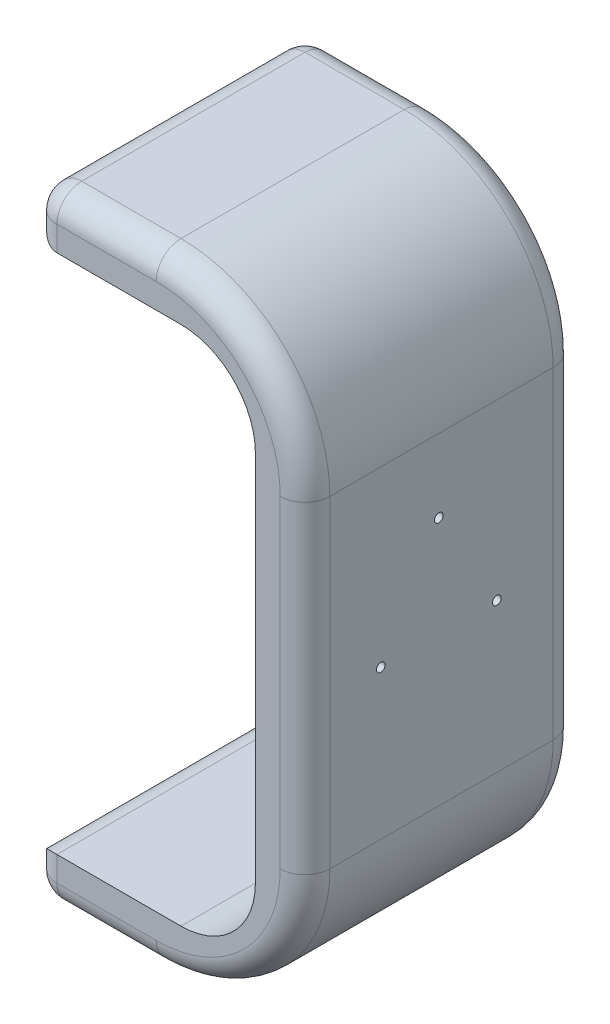
ISO-10303-21;
HEADER;
FILE_DESCRIPTION(('STEP AP214'),'2;1');
FILE_NAME('part.step','',(''),(''),'','','');
FILE_SCHEMA(('AUTOMOTIVE_DESIGN { 1 0 10303 214 1 1 1 1 }'));
ENDSEC;
DATA;
#1=APPLICATION_CONTEXT('core data for automotive mechanical design processes');
#2=APPLICATION_PROTOCOL_DEFINITION('international standard','automotive_design',2000,#1);
#3=PRODUCT_CONTEXT('',#1,'mechanical');
#4=PRODUCT('Part','Part','',(#3));
#5=PRODUCT_RELATED_PRODUCT_CATEGORY('part','',(#4));
#6=PRODUCT_DEFINITION_FORMATION('','',#4);
#7=PRODUCT_DEFINITION_CONTEXT('part definition',#1,'design');
#8=PRODUCT_DEFINITION('design','',#6,#7);
#9=PRODUCT_DEFINITION_SHAPE('','',#8);
#10=(LENGTH_UNIT() NAMED_UNIT(*) SI_UNIT(.MILLI.,.METRE.));
#11=(NAMED_UNIT(*) PLANE_ANGLE_UNIT() SI_UNIT($,.RADIAN.));
#12=(NAMED_UNIT(*) SI_UNIT($,.STERADIAN.) SOLID_ANGLE_UNIT());
#13=UNCERTAINTY_MEASURE_WITH_UNIT(LENGTH_MEASURE(1.E-05),#10,'distance_accuracy_value','');
#14=(GEOMETRIC_REPRESENTATION_CONTEXT(3) GLOBAL_UNCERTAINTY_ASSIGNED_CONTEXT((#13)) GLOBAL_UNIT_ASSIGNED_CONTEXT((#10,
#11,#12)) REPRESENTATION_CONTEXT('',''));
#15=CARTESIAN_POINT('',(0.,0.,0.));
#16=DIRECTION('',(0.,0.,1.));
#17=DIRECTION('',(1.,0.,0.));
#18=AXIS2_PLACEMENT_3D('',#15,#16,#17);
#19=CARTESIAN_POINT('',(90.,-20.,110.));
#20=DIRECTION('',(0.,1.,0.));
#21=DIRECTION('',(-1.,0.,0.));
#22=AXIS2_PLACEMENT_3D('',#19,#20,#21);
#23=PLANE('',#22);
#24=DIRECTION('',(1.,0.,0.));
#25=VECTOR('',#24,1.);
#26=CARTESIAN_POINT('',(90.,-20.,110.));
#27=LINE('',#26,#25);
#28=CARTESIAN_POINT('',(10.,-20.,110.));
#29=VERTEX_POINT('',#28);
#30=CARTESIAN_POINT('',(60.,-20.,110.));
#31=VERTEX_POINT('',#30);
#32=EDGE_CURVE('E734',#29,#31,#27,.T.);
#33=ORIENTED_EDGE('',*,*,#32,.F.);
#34=DIRECTION('',(0.,0.,-1.));
#35=VECTOR('',#34,1.);
#36=CARTESIAN_POINT('',(9.99999999999999,-20.,110.));
#37=LINE('',#36,#35);
#38=CARTESIAN_POINT('',(10.,-20.,0.));
#39=VERTEX_POINT('',#38);
#40=EDGE_CURVE('E312',#29,#39,#37,.T.);
#41=ORIENTED_EDGE('',*,*,#40,.T.);
#42=DIRECTION('',(1.,0.,0.));
#43=VECTOR('',#42,1.);
#44=CARTESIAN_POINT('',(90.,-20.,0.));
#45=LINE('',#44,#43);
#46=CARTESIAN_POINT('',(60.,-20.,0.));
#47=VERTEX_POINT('',#46);
#48=EDGE_CURVE('E219',#39,#47,#45,.T.);
#49=ORIENTED_EDGE('',*,*,#48,.T.);
#50=DIRECTION('',(0.,0.,-1.));
#51=VECTOR('',#50,1.);
#52=CARTESIAN_POINT('',(60.,-20.,110.));
#53=LINE('',#52,#51);
#54=EDGE_CURVE('E760',#47,#31,#53,.F.);
#55=ORIENTED_EDGE('',*,*,#54,.T.);
#56=EDGE_LOOP('',(#33,#41,#49,#55));
#57=FACE_BOUND('',#56,.T.);
#58=ADVANCED_FACE('F35',(#57),#23,.F.);
#59=CARTESIAN_POINT('',(90.,-230.,110.));
#60=DIRECTION('',(1.,0.,0.));
#61=DIRECTION('',(0.,0.,-1.));
#62=AXIS2_PLACEMENT_3D('',#59,#60,#61);
#63=PLANE('',#62);
#64=CARTESIAN_POINT('',(90.,-89.4408599082747,56.0696259528289));
#65=DIRECTION('',(-1.,0.,0.));
#66=DIRECTION('',(0.,0.,1.));
#67=AXIS2_PLACEMENT_3D('',#64,#65,#66);
#68=CIRCLE('',#67,1.75);
#69=CARTESIAN_POINT('',(90.,-89.4408599082747,57.8196259528289));
#70=VERTEX_POINT('',#69);
#71=EDGE_CURVE('E223',#70,#70,#68,.T.);
#72=ORIENTED_EDGE('',*,*,#71,.F.);
#73=EDGE_LOOP('',(#72));
#74=FACE_BOUND('',#73,.T.);
#75=CARTESIAN_POINT('',(90.,-129.940859908274,79.4523118550099));
#76=DIRECTION('',(-1.,0.,0.));
#77=DIRECTION('',(0.,0.,1.));
#78=AXIS2_PLACEMENT_3D('',#75,#76,#77);
#79=CIRCLE('',#78,1.75000000000002);
#80=CARTESIAN_POINT('',(90.,-129.940859908274,81.2023118550099));
#81=VERTEX_POINT('',#80);
#82=EDGE_CURVE('E781',#81,#81,#79,.T.);
#83=ORIENTED_EDGE('',*,*,#82,.F.);
#84=EDGE_LOOP('',(#83));
#85=FACE_BOUND('',#84,.T.);
#86=CARTESIAN_POINT('',(90.,-129.940859908275,32.6869400506501));
#87=DIRECTION('',(-1.,0.,0.));
#88=DIRECTION('',(0.,0.,1.));
#89=AXIS2_PLACEMENT_3D('',#86,#87,#88);
#90=CIRCLE('',#89,1.75);
#91=CARTESIAN_POINT('',(90.,-129.940859908275,34.4369400506501));
#92=VERTEX_POINT('',#91);
#93=EDGE_CURVE('E778',#92,#92,#90,.T.);
#94=ORIENTED_EDGE('',*,*,#93,.F.);
#95=EDGE_LOOP('',(#94));
#96=FACE_BOUND('',#95,.T.);
#97=DIRECTION('',(0.,-1.,0.));
#98=VECTOR('',#97,1.);
#99=CARTESIAN_POINT('',(90.,-230.,110.));
#100=LINE('',#99,#98);
#101=CARTESIAN_POINT('',(90.,-50.,110.));
#102=VERTEX_POINT('',#101);
#103=CARTESIAN_POINT('',(90.,-200.,110.));
#104=VERTEX_POINT('',#103);
#105=EDGE_CURVE('E774',#102,#104,#100,.T.);
#106=ORIENTED_EDGE('',*,*,#105,.F.);
#107=DIRECTION('',(0.,0.,-1.));
#108=VECTOR('',#107,1.);
#109=CARTESIAN_POINT('',(90.,-50.,0.));
#110=LINE('',#109,#108);
#111=CARTESIAN_POINT('',(90.,-50.,0.));
#112=VERTEX_POINT('',#111);
#113=EDGE_CURVE('E763',#102,#112,#110,.T.);
#114=ORIENTED_EDGE('',*,*,#113,.T.);
#115=DIRECTION('',(0.,-1.,0.));
#116=VECTOR('',#115,1.);
#117=CARTESIAN_POINT('',(90.,-230.,0.));
#118=LINE('',#117,#116);
#119=CARTESIAN_POINT('',(90.,-200.,0.));
#120=VERTEX_POINT('',#119);
#121=EDGE_CURVE('E735',#112,#120,#118,.T.);
#122=ORIENTED_EDGE('',*,*,#121,.T.);
#123=DIRECTION('',(0.,0.,-1.));
#124=VECTOR('',#123,1.);
#125=CARTESIAN_POINT('',(90.,-200.,110.));
#126=LINE('',#125,#124);
#127=EDGE_CURVE('E765',#120,#104,#126,.F.);
#128=ORIENTED_EDGE('',*,*,#127,.T.);
#129=EDGE_LOOP('',(#106,#114,#122,#128));
#130=FACE_BOUND('',#129,.T.);
#131=ADVANCED_FACE('F406',(#74,#85,#96,#130),#63,.F.);
#132=CARTESIAN_POINT('',(0.,-230.,110.));
#133=DIRECTION('',(0.,-1.,0.));
#134=DIRECTION('',(0.,0.,-1.));
#135=AXIS2_PLACEMENT_3D('',#132,#133,#134);
#136=PLANE('',#135);
#137=DIRECTION('',(-1.,0.,0.));
#138=VECTOR('',#137,1.);
#139=CARTESIAN_POINT('',(0.,-230.,0.));
#140=LINE('',#139,#138);
#141=CARTESIAN_POINT('',(60.,-230.,0.));
#142=VERTEX_POINT('',#141);
#143=CARTESIAN_POINT('',(10.,-230.,0.));
#144=VERTEX_POINT('',#143);
#145=EDGE_CURVE('E729',#142,#144,#140,.T.);
#146=ORIENTED_EDGE('',*,*,#145,.T.);
#147=DIRECTION('',(0.,0.,-1.));
#148=VECTOR('',#147,1.);
#149=CARTESIAN_POINT('',(10.,-230.,110.));
#150=LINE('',#149,#148);
#151=CARTESIAN_POINT('',(10.,-230.,110.));
#152=VERTEX_POINT('',#151);
#153=EDGE_CURVE('E314',#144,#152,#150,.F.);
#154=ORIENTED_EDGE('',*,*,#153,.T.);
#155=DIRECTION('',(-1.,0.,0.));
#156=VECTOR('',#155,1.);
#157=CARTESIAN_POINT('',(0.,-230.,110.));
#158=LINE('',#157,#156);
#159=CARTESIAN_POINT('',(60.,-230.,110.));
#160=VERTEX_POINT('',#159);
#161=EDGE_CURVE('E361',#160,#152,#158,.T.);
#162=ORIENTED_EDGE('',*,*,#161,.F.);
#163=DIRECTION('',(0.,0.,-1.));
#164=VECTOR('',#163,1.);
#165=CARTESIAN_POINT('',(60.,-230.,0.));
#166=LINE('',#165,#164);
#167=EDGE_CURVE('E733',#160,#142,#166,.T.);
#168=ORIENTED_EDGE('',*,*,#167,.T.);
#169=EDGE_LOOP('',(#146,#154,#162,#168));
#170=FACE_BOUND('',#169,.T.);
#171=ADVANCED_FACE('F412',(#170),#136,.F.);
#172=CARTESIAN_POINT('',(110.,-250.,110.));
#173=DIRECTION('',(0.,1.,0.));
#174=DIRECTION('',(0.,0.,1.));
#175=AXIS2_PLACEMENT_3D('',#172,#173,#174);
#176=PLANE('',#175);
#177=DIRECTION('',(0.,0.,-1.));
#178=VECTOR('',#177,1.);
#179=CARTESIAN_POINT('',(9.99999999999999,-250.,110.));
#180=LINE('',#179,#178);
#181=CARTESIAN_POINT('',(9.99999999999999,-250.,100.));
#182=VERTEX_POINT('',#181);
#183=CARTESIAN_POINT('',(9.99999999999999,-250.,9.99999999999999));
#184=VERTEX_POINT('',#183);
#185=EDGE_CURVE('E743',#182,#184,#180,.T.);
#186=ORIENTED_EDGE('',*,*,#185,.T.);
#187=DIRECTION('',(1.,0.,0.));
#188=VECTOR('',#187,1.);
#189=CARTESIAN_POINT('',(50.,-250.,9.99999999999999));
#190=LINE('',#189,#188);
#191=CARTESIAN_POINT('',(50.,-250.,9.99999999999999));
#192=VERTEX_POINT('',#191);
#193=EDGE_CURVE('E378',#184,#192,#190,.T.);
#194=ORIENTED_EDGE('',*,*,#193,.T.);
#195=DIRECTION('',(0.,0.,-1.));
#196=VECTOR('',#195,1.);
#197=CARTESIAN_POINT('',(50.,-250.,110.));
#198=LINE('',#197,#196);
#199=CARTESIAN_POINT('',(50.,-250.,100.));
#200=VERTEX_POINT('',#199);
#201=EDGE_CURVE('E767',#192,#200,#198,.F.);
#202=ORIENTED_EDGE('',*,*,#201,.T.);
#203=DIRECTION('',(1.,0.,0.));
#204=VECTOR('',#203,1.);
#205=CARTESIAN_POINT('',(110.,-250.,100.));
#206=LINE('',#205,#204);
#207=EDGE_CURVE('E747',#200,#182,#206,.F.);
#208=ORIENTED_EDGE('',*,*,#207,.T.);
#209=EDGE_LOOP('',(#186,#194,#202,#208));
#210=FACE_BOUND('',#209,.T.);
#211=ADVANCED_FACE('F685',(#210),#176,.F.);
#212=CARTESIAN_POINT('',(110.,0.,110.));
#213=DIRECTION('',(-1.,0.,0.));
#214=DIRECTION('',(0.,-1.,0.));
#215=AXIS2_PLACEMENT_3D('',#212,#213,#214);
#216=PLANE('',#215);
#217=CARTESIAN_POINT('',(110.,-89.4408599082747,56.0696259528289));
#218=DIRECTION('',(-1.,0.,0.));
#219=DIRECTION('',(0.,-1.,0.));
#220=AXIS2_PLACEMENT_3D('',#217,#218,#219);
#221=CIRCLE('',#220,1.75);
#222=CARTESIAN_POINT('',(110.,-91.1908599082747,56.0696259528289));
#223=VERTEX_POINT('',#222);
#224=EDGE_CURVE('E39',#223,#223,#221,.T.);
#225=ORIENTED_EDGE('',*,*,#224,.T.);
#226=EDGE_LOOP('',(#225));
#227=FACE_BOUND('',#226,.T.);
#228=CARTESIAN_POINT('',(110.,-129.940859908274,79.4523118550099));
#229=DIRECTION('',(-1.,0.,0.));
#230=DIRECTION('',(0.,-1.,0.));
#231=AXIS2_PLACEMENT_3D('',#228,#229,#230);
#232=CIRCLE('',#231,1.75000000000002);
#233=CARTESIAN_POINT('',(110.,-131.690859908274,79.4523118550099));
#234=VERTEX_POINT('',#233);
#235=EDGE_CURVE('E222',#234,#234,#232,.T.);
#236=ORIENTED_EDGE('',*,*,#235,.T.);
#237=EDGE_LOOP('',(#236));
#238=FACE_BOUND('',#237,.T.);
#239=CARTESIAN_POINT('',(110.,-129.940859908275,32.6869400506501));
#240=DIRECTION('',(-1.,0.,0.));
#241=DIRECTION('',(0.,-1.,0.));
#242=AXIS2_PLACEMENT_3D('',#239,#240,#241);
#243=CIRCLE('',#242,1.75);
#244=CARTESIAN_POINT('',(110.,-131.690859908275,32.6869400506501));
#245=VERTEX_POINT('',#244);
#246=EDGE_CURVE('E220',#245,#245,#243,.T.);
#247=ORIENTED_EDGE('',*,*,#246,.T.);
#248=EDGE_LOOP('',(#247));
#249=FACE_BOUND('',#248,.T.);
#250=DIRECTION('',(0.,0.,-1.));
#251=VECTOR('',#250,1.);
#252=CARTESIAN_POINT('',(110.,-190.,110.));
#253=LINE('',#252,#251);
#254=CARTESIAN_POINT('',(110.,-190.,100.));
#255=VERTEX_POINT('',#254);
#256=CARTESIAN_POINT('',(110.,-190.,9.99999999999999));
#257=VERTEX_POINT('',#256);
#258=EDGE_CURVE('E320',#255,#257,#253,.T.);
#259=ORIENTED_EDGE('',*,*,#258,.T.);
#260=DIRECTION('',(0.,1.,0.));
#261=VECTOR('',#260,1.);
#262=CARTESIAN_POINT('',(110.,-60.,9.99999999999999));
#263=LINE('',#262,#261);
#264=CARTESIAN_POINT('',(110.,-60.,9.99999999999999));
#265=VERTEX_POINT('',#264);
#266=EDGE_CURVE('E11',#257,#265,#263,.T.);
#267=ORIENTED_EDGE('',*,*,#266,.T.);
#268=DIRECTION('',(0.,0.,-1.));
#269=VECTOR('',#268,1.);
#270=CARTESIAN_POINT('',(110.,-60.,110.));
#271=LINE('',#270,#269);
#272=CARTESIAN_POINT('',(110.,-60.,100.));
#273=VERTEX_POINT('',#272);
#274=EDGE_CURVE('E323',#265,#273,#271,.F.);
#275=ORIENTED_EDGE('',*,*,#274,.T.);
#276=DIRECTION('',(0.,1.,0.));
#277=VECTOR('',#276,1.);
#278=CARTESIAN_POINT('',(110.,0.,100.));
#279=LINE('',#278,#277);
#280=EDGE_CURVE('E45',#273,#255,#279,.F.);
#281=ORIENTED_EDGE('',*,*,#280,.T.);
#282=EDGE_LOOP('',(#259,#267,#275,#281));
#283=FACE_BOUND('',#282,.T.);
#284=ADVANCED_FACE('F319',(#227,#238,#249,#283),#216,.F.);
#285=CARTESIAN_POINT('',(0.,0.,110.));
#286=DIRECTION('',(0.,-1.,0.));
#287=DIRECTION('',(0.,0.,-1.));
#288=AXIS2_PLACEMENT_3D('',#285,#286,#287);
#289=PLANE('',#288);
#290=DIRECTION('',(0.,0.,-1.));
#291=VECTOR('',#290,1.);
#292=CARTESIAN_POINT('',(50.,0.,110.));
#293=LINE('',#292,#291);
#294=CARTESIAN_POINT('',(50.,0.,100.));
#295=VERTEX_POINT('',#294);
#296=CARTESIAN_POINT('',(50.,0.,9.99999999999999));
#297=VERTEX_POINT('',#296);
#298=EDGE_CURVE('E331',#295,#297,#293,.T.);
#299=ORIENTED_EDGE('',*,*,#298,.T.);
#300=DIRECTION('',(-1.,0.,0.));
#301=VECTOR('',#300,1.);
#302=CARTESIAN_POINT('',(0.,0.,9.99999999999999));
#303=LINE('',#302,#301);
#304=CARTESIAN_POINT('',(10.,0.,9.99999999999999));
#305=VERTEX_POINT('',#304);
#306=EDGE_CURVE('E348',#297,#305,#303,.T.);
#307=ORIENTED_EDGE('',*,*,#306,.T.);
#308=DIRECTION('',(0.,0.,-1.));
#309=VECTOR('',#308,1.);
#310=CARTESIAN_POINT('',(10.,0.,110.));
#311=LINE('',#310,#309);
#312=CARTESIAN_POINT('',(10.,0.,100.));
#313=VERTEX_POINT('',#312);
#314=EDGE_CURVE('E340',#305,#313,#311,.F.);
#315=ORIENTED_EDGE('',*,*,#314,.T.);
#316=DIRECTION('',(-1.,0.,0.));
#317=VECTOR('',#316,1.);
#318=CARTESIAN_POINT('',(0.,0.,100.));
#319=LINE('',#318,#317);
#320=EDGE_CURVE('E205',#313,#295,#319,.F.);
#321=ORIENTED_EDGE('',*,*,#320,.T.);
#322=EDGE_LOOP('',(#299,#307,#315,#321));
#323=FACE_BOUND('',#322,.T.);
#324=ADVANCED_FACE('F359',(#323),#289,.F.);
#325=CARTESIAN_POINT('',(0.,0.,110.));
#326=DIRECTION('',(0.,0.,-1.));
#327=DIRECTION('',(-1.,0.,0.));
#328=AXIS2_PLACEMENT_3D('',#325,#326,#327);
#329=PLANE('',#328);
#330=ORIENTED_EDGE('',*,*,#161,.T.);
#331=DIRECTION('',(0.,-1.,0.));
#332=VECTOR('',#331,1.);
#333=CARTESIAN_POINT('',(10.,0.,110.));
#334=LINE('',#333,#332);
#335=CARTESIAN_POINT('',(10.,-240.,110.));
#336=VERTEX_POINT('',#335);
#337=EDGE_CURVE('E54',#152,#336,#334,.T.);
#338=ORIENTED_EDGE('',*,*,#337,.T.);
#339=DIRECTION('',(1.,0.,0.));
#340=VECTOR('',#339,1.);
#341=CARTESIAN_POINT('',(0.,-240.,110.));
#342=LINE('',#341,#340);
#343=CARTESIAN_POINT('',(50.,-240.,110.));
#344=VERTEX_POINT('',#343);
#345=EDGE_CURVE('E200',#336,#344,#342,.T.);
#346=ORIENTED_EDGE('',*,*,#345,.T.);
#347=CARTESIAN_POINT('',(50.,-190.,110.));
#348=DIRECTION('',(0.,0.,-1.));
#349=DIRECTION('',(-1.,0.,0.));
#350=AXIS2_PLACEMENT_3D('',#347,#348,#349);
#351=CIRCLE('',#350,50.);
#352=CARTESIAN_POINT('',(100.,-190.,110.));
#353=VERTEX_POINT('',#352);
#354=EDGE_CURVE('E195',#344,#353,#351,.F.);
#355=ORIENTED_EDGE('',*,*,#354,.T.);
#356=DIRECTION('',(0.,1.,0.));
#357=VECTOR('',#356,1.);
#358=CARTESIAN_POINT('',(100.,0.,110.));
#359=LINE('',#358,#357);
#360=CARTESIAN_POINT('',(100.,-60.,110.));
#361=VERTEX_POINT('',#360);
#362=EDGE_CURVE('E299',#353,#361,#359,.T.);
#363=ORIENTED_EDGE('',*,*,#362,.T.);
#364=CARTESIAN_POINT('',(50.,-60.,110.));
#365=DIRECTION('',(0.,0.,-1.));
#366=DIRECTION('',(-1.,0.,0.));
#367=AXIS2_PLACEMENT_3D('',#364,#365,#366);
#368=CIRCLE('',#367,50.);
#369=CARTESIAN_POINT('',(50.,-10.,110.));
#370=VERTEX_POINT('',#369);
#371=EDGE_CURVE('E190',#361,#370,#368,.F.);
#372=ORIENTED_EDGE('',*,*,#371,.T.);
#373=DIRECTION('',(-1.,0.,0.));
#374=VECTOR('',#373,1.);
#375=CARTESIAN_POINT('',(0.,-10.,110.));
#376=LINE('',#375,#374);
#377=CARTESIAN_POINT('',(10.,-10.,110.));
#378=VERTEX_POINT('',#377);
#379=EDGE_CURVE('E185',#370,#378,#376,.T.);
#380=ORIENTED_EDGE('',*,*,#379,.T.);
#381=DIRECTION('',(0.,-1.,0.));
#382=VECTOR('',#381,1.);
#383=CARTESIAN_POINT('',(10.,0.,110.));
#384=LINE('',#383,#382);
#385=EDGE_CURVE('E187',#378,#29,#384,.T.);
#386=ORIENTED_EDGE('',*,*,#385,.T.);
#387=ORIENTED_EDGE('',*,*,#32,.T.);
#388=CARTESIAN_POINT('',(60.,-50.,110.));
#389=DIRECTION('',(0.,0.,-1.));
#390=DIRECTION('',(-1.,0.,0.));
#391=AXIS2_PLACEMENT_3D('',#388,#389,#390);
#392=CIRCLE('',#391,30.);
#393=EDGE_CURVE('E756',#31,#102,#392,.T.);
#394=ORIENTED_EDGE('',*,*,#393,.T.);
#395=ORIENTED_EDGE('',*,*,#105,.T.);
#396=CARTESIAN_POINT('',(60.,-200.,110.));
#397=DIRECTION('',(0.,0.,-1.));
#398=DIRECTION('',(-1.,0.,0.));
#399=AXIS2_PLACEMENT_3D('',#396,#397,#398);
#400=CIRCLE('',#399,30.);
#401=EDGE_CURVE('E750',#104,#160,#400,.T.);
#402=ORIENTED_EDGE('',*,*,#401,.T.);
#403=EDGE_LOOP('',(#330,#338,#346,#355,#363,#372,#380,#386,#387,#394,#395,#402));
#404=FACE_BOUND('',#403,.T.);
#405=ADVANCED_FACE('F186',(#404),#329,.F.);
#406=CARTESIAN_POINT('',(0.,0.,0.));
#407=DIRECTION('',(0.,0.,-1.));
#408=DIRECTION('',(-1.,0.,0.));
#409=AXIS2_PLACEMENT_3D('',#406,#407,#408);
#410=PLANE('',#409);
#411=DIRECTION('',(1.,0.,0.));
#412=VECTOR('',#411,1.);
#413=CARTESIAN_POINT('',(0.,-240.,0.));
#414=LINE('',#413,#412);
#415=CARTESIAN_POINT('',(50.,-240.,0.));
#416=VERTEX_POINT('',#415);
#417=CARTESIAN_POINT('',(10.,-240.,0.));
#418=VERTEX_POINT('',#417);
#419=EDGE_CURVE('E383',#416,#418,#414,.F.);
#420=ORIENTED_EDGE('',*,*,#419,.T.);
#421=DIRECTION('',(0.,-1.,0.));
#422=VECTOR('',#421,1.);
#423=CARTESIAN_POINT('',(10.,-230.,0.));
#424=LINE('',#423,#422);
#425=EDGE_CURVE('E338',#418,#144,#424,.F.);
#426=ORIENTED_EDGE('',*,*,#425,.T.);
#427=ORIENTED_EDGE('',*,*,#145,.F.);
#428=CARTESIAN_POINT('',(60.,-200.,0.));
#429=DIRECTION('',(0.,0.,-1.));
#430=DIRECTION('',(-1.,0.,0.));
#431=AXIS2_PLACEMENT_3D('',#428,#429,#430);
#432=CIRCLE('',#431,30.);
#433=EDGE_CURVE('E754',#142,#120,#432,.F.);
#434=ORIENTED_EDGE('',*,*,#433,.T.);
#435=ORIENTED_EDGE('',*,*,#121,.F.);
#436=CARTESIAN_POINT('',(60.,-50.,0.));
#437=DIRECTION('',(0.,0.,-1.));
#438=DIRECTION('',(-1.,0.,0.));
#439=AXIS2_PLACEMENT_3D('',#436,#437,#438);
#440=CIRCLE('',#439,30.);
#441=EDGE_CURVE('E87',#112,#47,#440,.F.);
#442=ORIENTED_EDGE('',*,*,#441,.T.);
#443=ORIENTED_EDGE('',*,*,#48,.F.);
#444=DIRECTION('',(0.,-1.,0.));
#445=VECTOR('',#444,1.);
#446=CARTESIAN_POINT('',(10.,0.,0.));
#447=LINE('',#446,#445);
#448=CARTESIAN_POINT('',(10.,-10.,0.));
#449=VERTEX_POINT('',#448);
#450=EDGE_CURVE('E342',#39,#449,#447,.F.);
#451=ORIENTED_EDGE('',*,*,#450,.T.);
#452=DIRECTION('',(-1.,0.,0.));
#453=VECTOR('',#452,1.);
#454=CARTESIAN_POINT('',(50.,-10.,0.));
#455=LINE('',#454,#453);
#456=CARTESIAN_POINT('',(50.,-10.,0.));
#457=VERTEX_POINT('',#456);
#458=EDGE_CURVE('E373',#449,#457,#455,.F.);
#459=ORIENTED_EDGE('',*,*,#458,.T.);
#460=CARTESIAN_POINT('',(50.,-60.,0.));
#461=DIRECTION('',(0.,0.,-1.));
#462=DIRECTION('',(-1.,0.,0.));
#463=AXIS2_PLACEMENT_3D('',#460,#461,#462);
#464=CIRCLE('',#463,50.);
#465=CARTESIAN_POINT('',(100.,-60.,0.));
#466=VERTEX_POINT('',#465);
#467=EDGE_CURVE('E370',#457,#466,#464,.T.);
#468=ORIENTED_EDGE('',*,*,#467,.T.);
#469=DIRECTION('',(0.,1.,0.));
#470=VECTOR('',#469,1.);
#471=CARTESIAN_POINT('',(100.,-190.,0.));
#472=LINE('',#471,#470);
#473=CARTESIAN_POINT('',(100.,-190.,0.));
#474=VERTEX_POINT('',#473);
#475=EDGE_CURVE('E374',#466,#474,#472,.F.);
#476=ORIENTED_EDGE('',*,*,#475,.T.);
#477=CARTESIAN_POINT('',(50.,-190.,0.));
#478=DIRECTION('',(0.,0.,-1.));
#479=DIRECTION('',(-1.,0.,0.));
#480=AXIS2_PLACEMENT_3D('',#477,#478,#479);
#481=CIRCLE('',#480,50.);
#482=EDGE_CURVE('E376',#474,#416,#481,.T.);
#483=ORIENTED_EDGE('',*,*,#482,.T.);
#484=EDGE_LOOP('',(#420,#426,#427,#434,#435,#442,#443,#451,#459,#468,#476,#483));
#485=FACE_BOUND('',#484,.T.);
#486=ADVANCED_FACE('F388',(#485),#410,.T.);
#487=CARTESIAN_POINT('',(50.,-60.,110.));
#488=DIRECTION('',(0.,0.,-1.));
#489=DIRECTION('',(-1.,0.,0.));
#490=AXIS2_PLACEMENT_3D('',#487,#488,#489);
#491=CYLINDRICAL_SURFACE('',#490,60.);
#492=ORIENTED_EDGE('',*,*,#274,.F.);
#493=CARTESIAN_POINT('',(50.,-60.,9.99999999999999));
#494=DIRECTION('',(0.,0.,-1.));
#495=DIRECTION('',(-1.,0.,0.));
#496=AXIS2_PLACEMENT_3D('',#493,#494,#495);
#497=CIRCLE('',#496,60.);
#498=EDGE_CURVE('E305',#265,#297,#497,.F.);
#499=ORIENTED_EDGE('',*,*,#498,.T.);
#500=ORIENTED_EDGE('',*,*,#298,.F.);
#501=CARTESIAN_POINT('',(50.,-60.,100.));
#502=DIRECTION('',(0.,0.,-1.));
#503=DIRECTION('',(-1.,0.,0.));
#504=AXIS2_PLACEMENT_3D('',#501,#502,#503);
#505=CIRCLE('',#504,60.);
#506=EDGE_CURVE('E303',#295,#273,#505,.T.);
#507=ORIENTED_EDGE('',*,*,#506,.T.);
#508=EDGE_LOOP('',(#492,#499,#500,#507));
#509=FACE_BOUND('',#508,.T.);
#510=ADVANCED_FACE('F354',(#509),#491,.T.);
#511=CARTESIAN_POINT('',(50.,-190.,110.));
#512=DIRECTION('',(0.,0.,-1.));
#513=DIRECTION('',(-1.,0.,0.));
#514=AXIS2_PLACEMENT_3D('',#511,#512,#513);
#515=CYLINDRICAL_SURFACE('',#514,60.);
#516=ORIENTED_EDGE('',*,*,#201,.F.);
#517=CARTESIAN_POINT('',(50.,-190.,9.99999999999999));
#518=DIRECTION('',(0.,0.,-1.));
#519=DIRECTION('',(-1.,0.,0.));
#520=AXIS2_PLACEMENT_3D('',#517,#518,#519);
#521=CIRCLE('',#520,60.);
#522=EDGE_CURVE('E330',#192,#257,#521,.F.);
#523=ORIENTED_EDGE('',*,*,#522,.T.);
#524=ORIENTED_EDGE('',*,*,#258,.F.);
#525=CARTESIAN_POINT('',(50.,-190.,100.));
#526=DIRECTION('',(0.,0.,-1.));
#527=DIRECTION('',(-1.,0.,0.));
#528=AXIS2_PLACEMENT_3D('',#525,#526,#527);
#529=CIRCLE('',#528,60.);
#530=EDGE_CURVE('E328',#255,#200,#529,.T.);
#531=ORIENTED_EDGE('',*,*,#530,.T.);
#532=EDGE_LOOP('',(#516,#523,#524,#531));
#533=FACE_BOUND('',#532,.T.);
#534=ADVANCED_FACE('F326',(#533),#515,.T.);
#535=CARTESIAN_POINT('',(60.,-50.,110.));
#536=DIRECTION('',(0.,0.,1.));
#537=DIRECTION('',(1.,0.,0.));
#538=AXIS2_PLACEMENT_3D('',#535,#536,#537);
#539=CYLINDRICAL_SURFACE('',#538,30.);
#540=ORIENTED_EDGE('',*,*,#393,.F.);
#541=ORIENTED_EDGE('',*,*,#54,.F.);
#542=ORIENTED_EDGE('',*,*,#441,.F.);
#543=ORIENTED_EDGE('',*,*,#113,.F.);
#544=EDGE_LOOP('',(#540,#541,#542,#543));
#545=FACE_BOUND('',#544,.T.);
#546=ADVANCED_FACE('F421',(#545),#539,.F.);
#547=CARTESIAN_POINT('',(60.,-200.,110.));
#548=DIRECTION('',(0.,0.,1.));
#549=DIRECTION('',(1.,0.,0.));
#550=AXIS2_PLACEMENT_3D('',#547,#548,#549);
#551=CYLINDRICAL_SURFACE('',#550,30.);
#552=ORIENTED_EDGE('',*,*,#401,.F.);
#553=ORIENTED_EDGE('',*,*,#127,.F.);
#554=ORIENTED_EDGE('',*,*,#433,.F.);
#555=ORIENTED_EDGE('',*,*,#167,.F.);
#556=EDGE_LOOP('',(#552,#553,#554,#555));
#557=FACE_BOUND('',#556,.T.);
#558=ADVANCED_FACE('F424',(#557),#551,.F.);
#559=CARTESIAN_POINT('',(0.,-10.,100.));
#560=DIRECTION('',(-1.,0.,0.));
#561=DIRECTION('',(0.,0.,1.));
#562=AXIS2_PLACEMENT_3D('',#559,#560,#561);
#563=CYLINDRICAL_SURFACE('',#562,10.);
#564=CARTESIAN_POINT('',(10.,-10.,100.));
#565=DIRECTION('',(-1.,0.,0.));
#566=DIRECTION('',(0.,0.,1.));
#567=AXIS2_PLACEMENT_3D('',#564,#565,#566);
#568=CIRCLE('',#567,10.);
#569=EDGE_CURVE('E204',#378,#313,#568,.T.);
#570=ORIENTED_EDGE('',*,*,#569,.F.);
#571=ORIENTED_EDGE('',*,*,#379,.F.);
#572=CARTESIAN_POINT('',(50.,-10.,100.));
#573=DIRECTION('',(1.,0.,0.));
#574=DIRECTION('',(0.,0.,-1.));
#575=AXIS2_PLACEMENT_3D('',#572,#573,#574);
#576=CIRCLE('',#575,10.);
#577=EDGE_CURVE('E209',#295,#370,#576,.T.);
#578=ORIENTED_EDGE('',*,*,#577,.F.);
#579=ORIENTED_EDGE('',*,*,#320,.F.);
#580=EDGE_LOOP('',(#570,#571,#578,#579));
#581=FACE_BOUND('',#580,.T.);
#582=ADVANCED_FACE('F37',(#581),#563,.T.);
#583=CARTESIAN_POINT('',(10.,0.,100.));
#584=DIRECTION('',(0.,-1.,0.));
#585=DIRECTION('',(0.,0.,-1.));
#586=AXIS2_PLACEMENT_3D('',#583,#584,#585);
#587=CYLINDRICAL_SURFACE('',#586,10.);
#588=CARTESIAN_POINT('',(10.,-10.,100.));
#589=DIRECTION('',(0.,-0.707106781186547,-0.707106781186547));
#590=DIRECTION('',(0.,0.707106781186547,-0.707106781186547));
#591=AXIS2_PLACEMENT_3D('',#588,#589,#590);
#592=ELLIPSE('',#591,14.1421356237309,10.);
#593=CARTESIAN_POINT('',(0.,-10.,100.));
#594=VERTEX_POINT('',#593);
#595=EDGE_CURVE('E198',#29,#594,#592,.T.);
#596=ORIENTED_EDGE('',*,*,#595,.F.);
#597=ORIENTED_EDGE('',*,*,#385,.F.);
#598=CARTESIAN_POINT('',(10.,-10.,100.));
#599=DIRECTION('',(0.,1.,0.));
#600=DIRECTION('',(0.,0.,1.));
#601=AXIS2_PLACEMENT_3D('',#598,#599,#600);
#602=CIRCLE('',#601,10.);
#603=EDGE_CURVE('E79',#594,#378,#602,.T.);
#604=ORIENTED_EDGE('',*,*,#603,.F.);
#605=EDGE_LOOP('',(#596,#597,#604));
#606=FACE_BOUND('',#605,.T.);
#607=ADVANCED_FACE('F197',(#606),#587,.T.);
#608=CARTESIAN_POINT('',(50.,-60.,100.));
#609=DIRECTION('',(0.,0.,-1.));
#610=DIRECTION('',(-1.,0.,0.));
#611=AXIS2_PLACEMENT_3D('',#608,#609,#610);
#612=TOROIDAL_SURFACE('',#611,50.,10.);
#613=ORIENTED_EDGE('',*,*,#577,.T.);
#614=ORIENTED_EDGE('',*,*,#371,.F.);
#615=CARTESIAN_POINT('',(100.,-60.,100.));
#616=DIRECTION('',(0.,-1.,0.));
#617=DIRECTION('',(1.,0.,0.));
#618=AXIS2_PLACEMENT_3D('',#615,#616,#617);
#619=CIRCLE('',#618,10.);
#620=EDGE_CURVE('E214',#273,#361,#619,.T.);
#621=ORIENTED_EDGE('',*,*,#620,.F.);
#622=ORIENTED_EDGE('',*,*,#506,.F.);
#623=EDGE_LOOP('',(#613,#614,#621,#622));
#624=FACE_BOUND('',#623,.T.);
#625=ADVANCED_FACE('F302',(#624),#612,.T.);
#626=CARTESIAN_POINT('',(10.,-10.,100.));
#627=DIRECTION('',(0.,0.,1.));
#628=DIRECTION('',(1.,0.,0.));
#629=AXIS2_PLACEMENT_3D('',#626,#627,#628);
#630=SPHERICAL_SURFACE('',#629,10.);
#631=ORIENTED_EDGE('',*,*,#603,.T.);
#632=ORIENTED_EDGE('',*,*,#569,.T.);
#633=CARTESIAN_POINT('',(10.,-10.,100.));
#634=DIRECTION('',(0.,0.,1.));
#635=DIRECTION('',(1.,0.,0.));
#636=AXIS2_PLACEMENT_3D('',#633,#634,#635);
#637=CIRCLE('',#636,10.);
#638=EDGE_CURVE('E212',#594,#313,#637,.F.);
#639=ORIENTED_EDGE('',*,*,#638,.F.);
#640=EDGE_LOOP('',(#631,#632,#639));
#641=FACE_BOUND('',#640,.T.);
#642=ADVANCED_FACE('F211',(#641),#630,.T.);
#643=CARTESIAN_POINT('',(9.99999999999999,-10.,110.));
#644=DIRECTION('',(0.,0.,-1.));
#645=DIRECTION('',(-1.,0.,0.));
#646=AXIS2_PLACEMENT_3D('',#643,#644,#645);
#647=CYLINDRICAL_SURFACE('',#646,10.);
#648=ORIENTED_EDGE('',*,*,#40,.F.);
#649=ORIENTED_EDGE('',*,*,#595,.T.);
#650=DIRECTION('',(0.,0.,-1.));
#651=VECTOR('',#650,1.);
#652=CARTESIAN_POINT('',(0.,-10.,110.));
#653=LINE('',#652,#651);
#654=CARTESIAN_POINT('',(0.,-10.,9.99999999999999));
#655=VERTEX_POINT('',#654);
#656=EDGE_CURVE('E71',#655,#594,#653,.F.);
#657=ORIENTED_EDGE('',*,*,#656,.F.);
#658=CARTESIAN_POINT('',(10.,-10.,9.99999999999999));
#659=DIRECTION('',(0.,0.707106781186547,-0.707106781186547));
#660=DIRECTION('',(0.,-0.707106781186547,-0.707106781186547));
#661=AXIS2_PLACEMENT_3D('',#658,#659,#660);
#662=ELLIPSE('',#661,14.1421356237309,10.);
#663=EDGE_CURVE('E289',#39,#655,#662,.T.);
#664=ORIENTED_EDGE('',*,*,#663,.F.);
#665=EDGE_LOOP('',(#648,#649,#657,#664));
#666=FACE_BOUND('',#665,.T.);
#667=ADVANCED_FACE('F403',(#666),#647,.T.);
#668=CARTESIAN_POINT('',(100.,0.,100.));
#669=DIRECTION('',(0.,1.,0.));
#670=DIRECTION('',(-1.,0.,0.));
#671=AXIS2_PLACEMENT_3D('',#668,#669,#670);
#672=CYLINDRICAL_SURFACE('',#671,10.);
#673=ORIENTED_EDGE('',*,*,#620,.T.);
#674=ORIENTED_EDGE('',*,*,#362,.F.);
#675=CARTESIAN_POINT('',(100.,-190.,100.));
#676=DIRECTION('',(0.,-1.,0.));
#677=DIRECTION('',(0.,0.,-1.));
#678=AXIS2_PLACEMENT_3D('',#675,#676,#677);
#679=CIRCLE('',#678,10.);
#680=EDGE_CURVE('E286',#255,#353,#679,.T.);
#681=ORIENTED_EDGE('',*,*,#680,.F.);
#682=ORIENTED_EDGE('',*,*,#280,.F.);
#683=EDGE_LOOP('',(#673,#674,#681,#682));
#684=FACE_BOUND('',#683,.T.);
#685=ADVANCED_FACE('F297',(#684),#672,.T.);
#686=CARTESIAN_POINT('',(10.,-10.,110.));
#687=DIRECTION('',(0.,0.,-1.));
#688=DIRECTION('',(-1.,0.,0.));
#689=AXIS2_PLACEMENT_3D('',#686,#687,#688);
#690=CYLINDRICAL_SURFACE('',#689,10.);
#691=ORIENTED_EDGE('',*,*,#638,.T.);
#692=ORIENTED_EDGE('',*,*,#314,.F.);
#693=CARTESIAN_POINT('',(10.,-10.,9.99999999999999));
#694=DIRECTION('',(0.,0.,-1.));
#695=DIRECTION('',(-1.,0.,0.));
#696=AXIS2_PLACEMENT_3D('',#693,#694,#695);
#697=CIRCLE('',#696,10.);
#698=EDGE_CURVE('E283',#655,#305,#697,.T.);
#699=ORIENTED_EDGE('',*,*,#698,.F.);
#700=ORIENTED_EDGE('',*,*,#656,.T.);
#701=EDGE_LOOP('',(#691,#692,#699,#700));
#702=FACE_BOUND('',#701,.T.);
#703=ADVANCED_FACE('F395',(#702),#690,.T.);
#704=CARTESIAN_POINT('',(10.,-20.,9.99999999999999));
#705=DIRECTION('',(0.,1.,0.));
#706=DIRECTION('',(0.,0.,1.));
#707=AXIS2_PLACEMENT_3D('',#704,#705,#706);
#708=CYLINDRICAL_SURFACE('',#707,10.);
#709=ORIENTED_EDGE('',*,*,#450,.F.);
#710=ORIENTED_EDGE('',*,*,#663,.T.);
#711=CARTESIAN_POINT('',(10.,-10.,10.));
#712=DIRECTION('',(0.,1.,0.));
#713=DIRECTION('',(0.,0.,1.));
#714=AXIS2_PLACEMENT_3D('',#711,#712,#713);
#715=CIRCLE('',#714,10.);
#716=EDGE_CURVE('E280',#449,#655,#715,.T.);
#717=ORIENTED_EDGE('',*,*,#716,.F.);
#718=EDGE_LOOP('',(#709,#710,#717));
#719=FACE_BOUND('',#718,.T.);
#720=ADVANCED_FACE('F390',(#719),#708,.T.);
#721=CARTESIAN_POINT('',(50.,-190.,100.));
#722=DIRECTION('',(0.,0.,-1.));
#723=DIRECTION('',(-1.,0.,0.));
#724=AXIS2_PLACEMENT_3D('',#721,#722,#723);
#725=TOROIDAL_SURFACE('',#724,50.,10.);
#726=ORIENTED_EDGE('',*,*,#680,.T.);
#727=ORIENTED_EDGE('',*,*,#354,.F.);
#728=CARTESIAN_POINT('',(50.,-240.,100.));
#729=DIRECTION('',(-1.,0.,0.));
#730=DIRECTION('',(0.,0.,1.));
#731=AXIS2_PLACEMENT_3D('',#728,#729,#730);
#732=CIRCLE('',#731,10.);
#733=EDGE_CURVE('E277',#200,#344,#732,.T.);
#734=ORIENTED_EDGE('',*,*,#733,.F.);
#735=ORIENTED_EDGE('',*,*,#530,.F.);
#736=EDGE_LOOP('',(#726,#727,#734,#735));
#737=FACE_BOUND('',#736,.T.);
#738=ADVANCED_FACE('F336',(#737),#725,.T.);
#739=CARTESIAN_POINT('',(10.,-10.,10.));
#740=DIRECTION('',(-1.,0.,0.));
#741=DIRECTION('',(0.,0.,1.));
#742=AXIS2_PLACEMENT_3D('',#739,#740,#741);
#743=SPHERICAL_SURFACE('',#742,10.);
#744=ORIENTED_EDGE('',*,*,#716,.T.);
#745=ORIENTED_EDGE('',*,*,#698,.T.);
#746=CARTESIAN_POINT('',(10.,-10.,9.99999999999999));
#747=DIRECTION('',(-1.,0.,0.));
#748=DIRECTION('',(0.,0.,1.));
#749=AXIS2_PLACEMENT_3D('',#746,#747,#748);
#750=CIRCLE('',#749,10.);
#751=EDGE_CURVE('E274',#449,#305,#750,.F.);
#752=ORIENTED_EDGE('',*,*,#751,.F.);
#753=EDGE_LOOP('',(#744,#745,#752));
#754=FACE_BOUND('',#753,.T.);
#755=ADVANCED_FACE('F393',(#754),#743,.T.);
#756=CARTESIAN_POINT('',(10.,0.,100.));
#757=DIRECTION('',(0.,-1.,0.));
#758=DIRECTION('',(0.,0.,-1.));
#759=AXIS2_PLACEMENT_3D('',#756,#757,#758);
#760=CYLINDRICAL_SURFACE('',#759,10.);
#761=CARTESIAN_POINT('',(10.,-240.,100.));
#762=DIRECTION('',(0.,-1.,0.));
#763=DIRECTION('',(0.,0.,-1.));
#764=AXIS2_PLACEMENT_3D('',#761,#762,#763);
#765=CIRCLE('',#764,10.);
#766=CARTESIAN_POINT('',(0.,-240.,100.));
#767=VERTEX_POINT('',#766);
#768=EDGE_CURVE('E268',#336,#767,#765,.T.);
#769=ORIENTED_EDGE('',*,*,#768,.F.);
#770=ORIENTED_EDGE('',*,*,#337,.F.);
#771=CARTESIAN_POINT('',(10.,-240.,100.));
#772=DIRECTION('',(0.,0.707106781186547,-0.707106781186547));
#773=DIRECTION('',(0.,-0.707106781186547,-0.707106781186547));
#774=AXIS2_PLACEMENT_3D('',#771,#772,#773);
#775=ELLIPSE('',#774,14.1421356237309,10.);
#776=EDGE_CURVE('E271',#767,#152,#775,.T.);
#777=ORIENTED_EDGE('',*,*,#776,.F.);
#778=EDGE_LOOP('',(#769,#770,#777));
#779=FACE_BOUND('',#778,.T.);
#780=ADVANCED_FACE('F467',(#779),#760,.T.);
#781=CARTESIAN_POINT('',(0.,-240.,100.));
#782=DIRECTION('',(1.,0.,0.));
#783=DIRECTION('',(0.,0.,-1.));
#784=AXIS2_PLACEMENT_3D('',#781,#782,#783);
#785=CYLINDRICAL_SURFACE('',#784,10.);
#786=ORIENTED_EDGE('',*,*,#733,.T.);
#787=ORIENTED_EDGE('',*,*,#345,.F.);
#788=CARTESIAN_POINT('',(9.99999999999999,-240.,100.));
#789=DIRECTION('',(-1.,0.,0.));
#790=DIRECTION('',(0.,0.,1.));
#791=AXIS2_PLACEMENT_3D('',#788,#789,#790);
#792=CIRCLE('',#791,10.);
#793=EDGE_CURVE('E265',#182,#336,#792,.T.);
#794=ORIENTED_EDGE('',*,*,#793,.F.);
#795=ORIENTED_EDGE('',*,*,#207,.F.);
#796=EDGE_LOOP('',(#786,#787,#794,#795));
#797=FACE_BOUND('',#796,.T.);
#798=ADVANCED_FACE('F464',(#797),#785,.T.);
#799=CARTESIAN_POINT('',(0.,-10.,9.99999999999999));
#800=DIRECTION('',(1.,0.,0.));
#801=DIRECTION('',(0.,0.,-1.));
#802=AXIS2_PLACEMENT_3D('',#799,#800,#801);
#803=CYLINDRICAL_SURFACE('',#802,10.);
#804=ORIENTED_EDGE('',*,*,#751,.T.);
#805=ORIENTED_EDGE('',*,*,#306,.F.);
#806=CARTESIAN_POINT('',(50.,-10.,10.));
#807=DIRECTION('',(1.,0.,0.));
#808=DIRECTION('',(0.,0.,-1.));
#809=AXIS2_PLACEMENT_3D('',#806,#807,#808);
#810=CIRCLE('',#809,10.);
#811=EDGE_CURVE('E262',#457,#297,#810,.T.);
#812=ORIENTED_EDGE('',*,*,#811,.F.);
#813=ORIENTED_EDGE('',*,*,#458,.F.);
#814=EDGE_LOOP('',(#804,#805,#812,#813));
#815=FACE_BOUND('',#814,.T.);
#816=ADVANCED_FACE('F365',(#815),#803,.T.);
#817=CARTESIAN_POINT('',(10.,-240.,110.));
#818=DIRECTION('',(0.,0.,-1.));
#819=DIRECTION('',(-1.,0.,0.));
#820=AXIS2_PLACEMENT_3D('',#817,#818,#819);
#821=CYLINDRICAL_SURFACE('',#820,10.);
#822=ORIENTED_EDGE('',*,*,#776,.T.);
#823=ORIENTED_EDGE('',*,*,#153,.F.);
#824=CARTESIAN_POINT('',(10.,-240.,9.99999999999999));
#825=DIRECTION('',(0.,-0.707106781186547,-0.707106781186547));
#826=DIRECTION('',(0.,0.707106781186547,-0.707106781186547));
#827=AXIS2_PLACEMENT_3D('',#824,#825,#826);
#828=ELLIPSE('',#827,14.1421356237309,10.);
#829=CARTESIAN_POINT('',(0.,-240.,9.99999999999999));
#830=VERTEX_POINT('',#829);
#831=EDGE_CURVE('E259',#830,#144,#828,.T.);
#832=ORIENTED_EDGE('',*,*,#831,.F.);
#833=DIRECTION('',(0.,0.,-1.));
#834=VECTOR('',#833,1.);
#835=CARTESIAN_POINT('',(0.,-240.,110.));
#836=LINE('',#835,#834);
#837=EDGE_CURVE('E256',#767,#830,#836,.T.);
#838=ORIENTED_EDGE('',*,*,#837,.F.);
#839=EDGE_LOOP('',(#822,#823,#832,#838));
#840=FACE_BOUND('',#839,.T.);
#841=ADVANCED_FACE('F457',(#840),#821,.T.);
#842=CARTESIAN_POINT('',(10.,-240.,100.));
#843=DIRECTION('',(0.,0.,1.));
#844=DIRECTION('',(1.,0.,0.));
#845=AXIS2_PLACEMENT_3D('',#842,#843,#844);
#846=SPHERICAL_SURFACE('',#845,10.);
#847=ORIENTED_EDGE('',*,*,#793,.T.);
#848=ORIENTED_EDGE('',*,*,#768,.T.);
#849=CARTESIAN_POINT('',(10.,-240.,100.));
#850=DIRECTION('',(0.,0.,1.));
#851=DIRECTION('',(1.,0.,0.));
#852=AXIS2_PLACEMENT_3D('',#849,#850,#851);
#853=CIRCLE('',#852,10.);
#854=EDGE_CURVE('E253',#182,#767,#853,.F.);
#855=ORIENTED_EDGE('',*,*,#854,.F.);
#856=EDGE_LOOP('',(#847,#848,#855));
#857=FACE_BOUND('',#856,.T.);
#858=ADVANCED_FACE('F454',(#857),#846,.T.);
#859=CARTESIAN_POINT('',(50.,-60.,9.99999999999999));
#860=DIRECTION('',(0.,0.,-1.));
#861=DIRECTION('',(-1.,0.,0.));
#862=AXIS2_PLACEMENT_3D('',#859,#860,#861);
#863=TOROIDAL_SURFACE('',#862,50.,10.);
#864=ORIENTED_EDGE('',*,*,#811,.T.);
#865=ORIENTED_EDGE('',*,*,#498,.F.);
#866=CARTESIAN_POINT('',(100.,-60.,10.));
#867=DIRECTION('',(0.,-1.,0.));
#868=DIRECTION('',(1.,0.,0.));
#869=AXIS2_PLACEMENT_3D('',#866,#867,#868);
#870=CIRCLE('',#869,10.);
#871=EDGE_CURVE('E250',#466,#265,#870,.T.);
#872=ORIENTED_EDGE('',*,*,#871,.F.);
#873=ORIENTED_EDGE('',*,*,#467,.F.);
#874=EDGE_LOOP('',(#864,#865,#872,#873));
#875=FACE_BOUND('',#874,.T.);
#876=ADVANCED_FACE('F369',(#875),#863,.T.);
#877=CARTESIAN_POINT('',(10.,-250.,9.99999999999999));
#878=DIRECTION('',(0.,1.,0.));
#879=DIRECTION('',(0.,0.,1.));
#880=AXIS2_PLACEMENT_3D('',#877,#878,#879);
#881=CYLINDRICAL_SURFACE('',#880,10.);
#882=ORIENTED_EDGE('',*,*,#831,.T.);
#883=ORIENTED_EDGE('',*,*,#425,.F.);
#884=CARTESIAN_POINT('',(10.,-240.,9.99999999999999));
#885=DIRECTION('',(0.,-1.,0.));
#886=DIRECTION('',(0.,0.,-1.));
#887=AXIS2_PLACEMENT_3D('',#884,#885,#886);
#888=CIRCLE('',#887,10.);
#889=EDGE_CURVE('E247',#830,#418,#888,.T.);
#890=ORIENTED_EDGE('',*,*,#889,.F.);
#891=EDGE_LOOP('',(#882,#883,#890));
#892=FACE_BOUND('',#891,.T.);
#893=ADVANCED_FACE('F447',(#892),#881,.T.);
#894=CARTESIAN_POINT('',(9.99999999999999,-240.,110.));
#895=DIRECTION('',(0.,0.,-1.));
#896=DIRECTION('',(-1.,0.,0.));
#897=AXIS2_PLACEMENT_3D('',#894,#895,#896);
#898=CYLINDRICAL_SURFACE('',#897,10.);
#899=ORIENTED_EDGE('',*,*,#854,.T.);
#900=ORIENTED_EDGE('',*,*,#837,.T.);
#901=CARTESIAN_POINT('',(9.99999999999999,-240.,9.99999999999999));
#902=DIRECTION('',(0.,0.,-1.));
#903=DIRECTION('',(-1.,0.,0.));
#904=AXIS2_PLACEMENT_3D('',#901,#902,#903);
#905=CIRCLE('',#904,10.);
#906=EDGE_CURVE('E244',#184,#830,#905,.T.);
#907=ORIENTED_EDGE('',*,*,#906,.F.);
#908=ORIENTED_EDGE('',*,*,#185,.F.);
#909=EDGE_LOOP('',(#899,#900,#907,#908));
#910=FACE_BOUND('',#909,.T.);
#911=ADVANCED_FACE('F443',(#910),#898,.T.);
#912=CARTESIAN_POINT('',(100.,0.,9.99999999999999));
#913=DIRECTION('',(0.,-1.,0.));
#914=DIRECTION('',(1.,0.,0.));
#915=AXIS2_PLACEMENT_3D('',#912,#913,#914);
#916=CYLINDRICAL_SURFACE('',#915,10.);
#917=ORIENTED_EDGE('',*,*,#871,.T.);
#918=ORIENTED_EDGE('',*,*,#266,.F.);
#919=CARTESIAN_POINT('',(100.,-190.,10.));
#920=DIRECTION('',(0.,-1.,0.));
#921=DIRECTION('',(0.,0.,-1.));
#922=AXIS2_PLACEMENT_3D('',#919,#920,#921);
#923=CIRCLE('',#922,10.);
#924=EDGE_CURVE('E238',#474,#257,#923,.T.);
#925=ORIENTED_EDGE('',*,*,#924,.F.);
#926=ORIENTED_EDGE('',*,*,#475,.F.);
#927=EDGE_LOOP('',(#917,#918,#925,#926));
#928=FACE_BOUND('',#927,.T.);
#929=ADVANCED_FACE('F439',(#928),#916,.T.);
#930=CARTESIAN_POINT('',(10.,-240.,10.));
#931=DIRECTION('',(-1.,0.,0.));
#932=DIRECTION('',(0.,0.,1.));
#933=AXIS2_PLACEMENT_3D('',#930,#931,#932);
#934=SPHERICAL_SURFACE('',#933,10.);
#935=ORIENTED_EDGE('',*,*,#906,.T.);
#936=ORIENTED_EDGE('',*,*,#889,.T.);
#937=CARTESIAN_POINT('',(10.,-240.,10.));
#938=DIRECTION('',(-1.,0.,0.));
#939=DIRECTION('',(0.,-1.,0.));
#940=AXIS2_PLACEMENT_3D('',#937,#938,#939);
#941=CIRCLE('',#940,10.);
#942=EDGE_CURVE('E231',#184,#418,#941,.F.);
#943=ORIENTED_EDGE('',*,*,#942,.F.);
#944=EDGE_LOOP('',(#935,#936,#943));
#945=FACE_BOUND('',#944,.T.);
#946=ADVANCED_FACE('F435',(#945),#934,.T.);
#947=CARTESIAN_POINT('',(50.,-190.,9.99999999999999));
#948=DIRECTION('',(0.,0.,-1.));
#949=DIRECTION('',(-1.,0.,0.));
#950=AXIS2_PLACEMENT_3D('',#947,#948,#949);
#951=TOROIDAL_SURFACE('',#950,50.,10.);
#952=ORIENTED_EDGE('',*,*,#924,.T.);
#953=ORIENTED_EDGE('',*,*,#522,.F.);
#954=CARTESIAN_POINT('',(50.,-240.,10.));
#955=DIRECTION('',(-1.,0.,0.));
#956=DIRECTION('',(0.,0.,1.));
#957=AXIS2_PLACEMENT_3D('',#954,#955,#956);
#958=CIRCLE('',#957,10.);
#959=EDGE_CURVE('E228',#416,#192,#958,.T.);
#960=ORIENTED_EDGE('',*,*,#959,.F.);
#961=ORIENTED_EDGE('',*,*,#482,.F.);
#962=EDGE_LOOP('',(#952,#953,#960,#961));
#963=FACE_BOUND('',#962,.T.);
#964=ADVANCED_FACE('F432',(#963),#951,.T.);
#965=CARTESIAN_POINT('',(110.,-240.,9.99999999999999));
#966=DIRECTION('',(-1.,0.,0.));
#967=DIRECTION('',(0.,0.,1.));
#968=AXIS2_PLACEMENT_3D('',#965,#966,#967);
#969=CYLINDRICAL_SURFACE('',#968,10.);
#970=ORIENTED_EDGE('',*,*,#942,.T.);
#971=ORIENTED_EDGE('',*,*,#419,.F.);
#972=ORIENTED_EDGE('',*,*,#959,.T.);
#973=ORIENTED_EDGE('',*,*,#193,.F.);
#974=EDGE_LOOP('',(#970,#971,#972,#973));
#975=FACE_BOUND('',#974,.T.);
#976=ADVANCED_FACE('F428',(#975),#969,.T.);
#977=CARTESIAN_POINT('',(340.,-129.940859908275,32.6869400506501));
#978=DIRECTION('',(-1.,0.,0.));
#979=DIRECTION('',(0.,0.,1.));
#980=AXIS2_PLACEMENT_3D('',#977,#978,#979);
#981=CYLINDRICAL_SURFACE('',#980,1.75);
#982=ORIENTED_EDGE('',*,*,#93,.T.);
#983=EDGE_LOOP('',(#982));
#984=FACE_BOUND('',#983,.T.);
#985=ORIENTED_EDGE('',*,*,#246,.F.);
#986=EDGE_LOOP('',(#985));
#987=FACE_BOUND('',#986,.T.);
#988=ADVANCED_FACE('F431',(#984,#987),#981,.F.);
#989=CARTESIAN_POINT('',(340.,-129.940859908274,79.4523118550099));
#990=DIRECTION('',(-1.,0.,0.));
#991=DIRECTION('',(0.,0.,1.));
#992=AXIS2_PLACEMENT_3D('',#989,#990,#991);
#993=CYLINDRICAL_SURFACE('',#992,1.75000000000002);
#994=ORIENTED_EDGE('',*,*,#82,.T.);
#995=EDGE_LOOP('',(#994));
#996=FACE_BOUND('',#995,.T.);
#997=ORIENTED_EDGE('',*,*,#235,.F.);
#998=EDGE_LOOP('',(#997));
#999=FACE_BOUND('',#998,.T.);
#1000=ADVANCED_FACE('F538',(#996,#999),#993,.F.);
#1001=CARTESIAN_POINT('',(340.,-89.4408599082747,56.0696259528289));
#1002=DIRECTION('',(-1.,0.,0.));
#1003=DIRECTION('',(0.,0.,1.));
#1004=AXIS2_PLACEMENT_3D('',#1001,#1002,#1003);
#1005=CYLINDRICAL_SURFACE('',#1004,1.75);
#1006=ORIENTED_EDGE('',*,*,#71,.T.);
#1007=EDGE_LOOP('',(#1006));
#1008=FACE_BOUND('',#1007,.T.);
#1009=ORIENTED_EDGE('',*,*,#224,.F.);
#1010=EDGE_LOOP('',(#1009));
#1011=FACE_BOUND('',#1010,.T.);
#1012=ADVANCED_FACE('F547',(#1008,#1011),#1005,.F.);
#1013=CLOSED_SHELL('',(#58,#131,#171,#211,#284,#324,#405,#486,#510,#534,#546,#558,#582,#607,
#625,#642,#667,#685,#703,#720,#738,#755,#780,#798,#816,#841,#858,#876,#893,#911,#929,#946,#964,
#976,#988,#1000,#1012));
#1014=MANIFOLD_SOLID_BREP('B2',#1013);
#1015=ADVANCED_BREP_SHAPE_REPRESENTATION('',(#18,#1014),#14);
#1016=SHAPE_DEFINITION_REPRESENTATION(#9,#1015);
ENDSEC;
END-ISO-10303-21;
